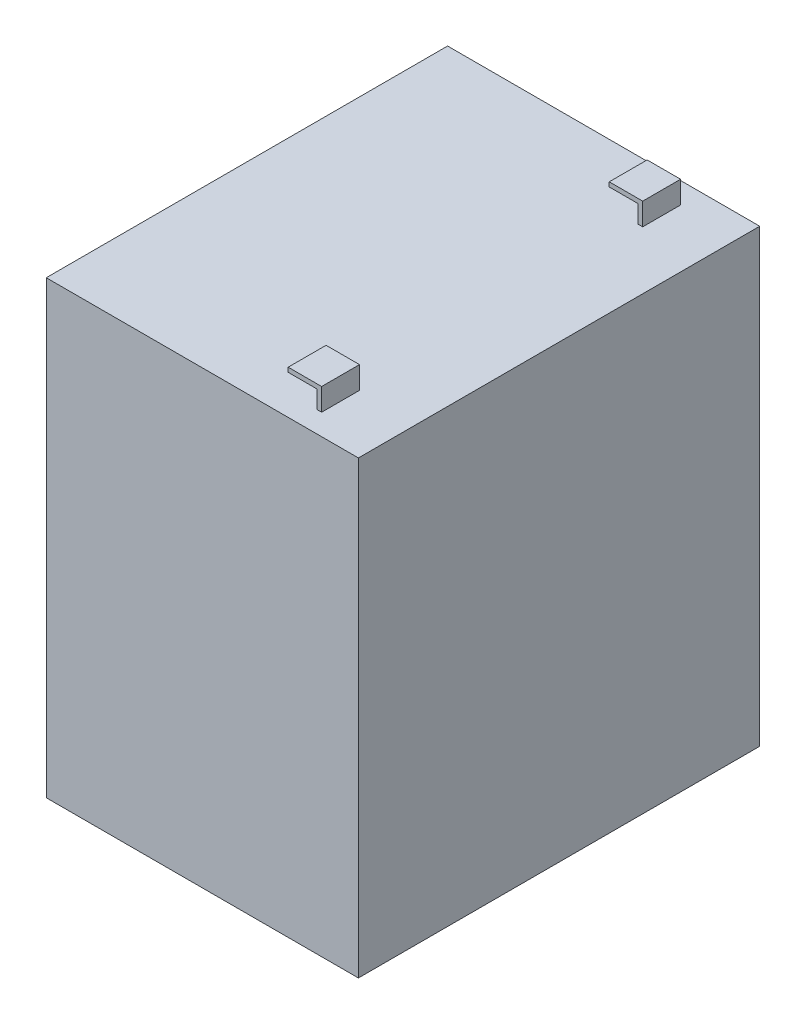
ISO-10303-21;
HEADER;
FILE_DESCRIPTION(('STEP AP214'),'2;1');
FILE_NAME('part.step','',(''),(''),'','','');
FILE_SCHEMA(('AUTOMOTIVE_DESIGN { 1 0 10303 214 1 1 1 1 }'));
ENDSEC;
DATA;
#1=APPLICATION_CONTEXT('core data for automotive mechanical design processes');
#2=APPLICATION_PROTOCOL_DEFINITION('international standard','automotive_design',2000,#1);
#3=PRODUCT_CONTEXT('',#1,'mechanical');
#4=PRODUCT('Part','Part','',(#3));
#5=PRODUCT_RELATED_PRODUCT_CATEGORY('part','',(#4));
#6=PRODUCT_DEFINITION_FORMATION('','',#4);
#7=PRODUCT_DEFINITION_CONTEXT('part definition',#1,'design');
#8=PRODUCT_DEFINITION('design','',#6,#7);
#9=PRODUCT_DEFINITION_SHAPE('','',#8);
#10=(LENGTH_UNIT() NAMED_UNIT(*) SI_UNIT(.MILLI.,.METRE.));
#11=(NAMED_UNIT(*) PLANE_ANGLE_UNIT() SI_UNIT($,.RADIAN.));
#12=(NAMED_UNIT(*) SI_UNIT($,.STERADIAN.) SOLID_ANGLE_UNIT());
#13=UNCERTAINTY_MEASURE_WITH_UNIT(LENGTH_MEASURE(1.E-05),#10,'distance_accuracy_value','');
#14=(GEOMETRIC_REPRESENTATION_CONTEXT(3) GLOBAL_UNCERTAINTY_ASSIGNED_CONTEXT((#13)) GLOBAL_UNIT_ASSIGNED_CONTEXT((#10,
#11,#12)) REPRESENTATION_CONTEXT('',''));
#15=CARTESIAN_POINT('',(0.,0.,0.));
#16=DIRECTION('',(0.,0.,1.));
#17=DIRECTION('',(1.,0.,0.));
#18=AXIS2_PLACEMENT_3D('',#15,#16,#17);
#19=CARTESIAN_POINT('',(-35.,101.,45.));
#20=DIRECTION('',(0.,1.,0.));
#21=DIRECTION('',(0.,0.,1.));
#22=AXIS2_PLACEMENT_3D('',#19,#20,#21);
#23=PLANE('',#22);
#24=DIRECTION('',(1.,0.,0.));
#25=VECTOR('',#24,1.);
#26=CARTESIAN_POINT('',(14.5,101.,-31.75));
#27=LINE('',#26,#25);
#28=CARTESIAN_POINT('',(21.,101.,-31.75));
#29=VERTEX_POINT('',#28);
#30=CARTESIAN_POINT('',(22.,101.,-31.75));
#31=VERTEX_POINT('',#30);
#32=EDGE_CURVE('E193',#29,#31,#27,.T.);
#33=ORIENTED_EDGE('',*,*,#32,.F.);
#34=DIRECTION('',(0.,0.,1.));
#35=VECTOR('',#34,1.);
#36=CARTESIAN_POINT('',(21.,101.,-45.));
#37=LINE('',#36,#35);
#38=CARTESIAN_POINT('',(21.,101.,-40.25));
#39=VERTEX_POINT('',#38);
#40=EDGE_CURVE('E48',#39,#29,#37,.T.);
#41=ORIENTED_EDGE('',*,*,#40,.F.);
#42=DIRECTION('',(-1.,0.,0.));
#43=VECTOR('',#42,1.);
#44=CARTESIAN_POINT('',(14.5,101.,-40.25));
#45=LINE('',#44,#43);
#46=CARTESIAN_POINT('',(22.,101.,-40.25));
#47=VERTEX_POINT('',#46);
#48=EDGE_CURVE('E198',#47,#39,#45,.T.);
#49=ORIENTED_EDGE('',*,*,#48,.F.);
#50=DIRECTION('',(0.,0.,-1.));
#51=VECTOR('',#50,1.);
#52=CARTESIAN_POINT('',(22.,101.,-40.25));
#53=LINE('',#52,#51);
#54=EDGE_CURVE('E206',#31,#47,#53,.T.);
#55=ORIENTED_EDGE('',*,*,#54,.F.);
#56=EDGE_LOOP('',(#33,#41,#49,#55));
#57=FACE_BOUND('',#56,.T.);
#58=DIRECTION('',(-1.,0.,0.));
#59=VECTOR('',#58,1.);
#60=CARTESIAN_POINT('',(-35.,101.,-45.));
#61=LINE('',#60,#59);
#62=CARTESIAN_POINT('',(35.,101.,-45.));
#63=VERTEX_POINT('',#62);
#64=CARTESIAN_POINT('',(-35.,101.,-45.));
#65=VERTEX_POINT('',#64);
#66=EDGE_CURVE('E234',#63,#65,#61,.T.);
#67=ORIENTED_EDGE('',*,*,#66,.T.);
#68=DIRECTION('',(0.,0.,1.));
#69=VECTOR('',#68,1.);
#70=CARTESIAN_POINT('',(-35.,101.,-45.));
#71=LINE('',#70,#69);
#72=CARTESIAN_POINT('',(-35.,101.,45.));
#73=VERTEX_POINT('',#72);
#74=EDGE_CURVE('E227',#65,#73,#71,.T.);
#75=ORIENTED_EDGE('',*,*,#74,.T.);
#76=DIRECTION('',(1.,0.,0.));
#77=VECTOR('',#76,1.);
#78=CARTESIAN_POINT('',(-35.,101.,45.));
#79=LINE('',#78,#77);
#80=CARTESIAN_POINT('',(35.,101.,45.));
#81=VERTEX_POINT('',#80);
#82=EDGE_CURVE('E230',#73,#81,#79,.T.);
#83=ORIENTED_EDGE('',*,*,#82,.T.);
#84=DIRECTION('',(0.,0.,-1.));
#85=VECTOR('',#84,1.);
#86=CARTESIAN_POINT('',(35.,101.,-45.));
#87=LINE('',#86,#85);
#88=EDGE_CURVE('E232',#81,#63,#87,.T.);
#89=ORIENTED_EDGE('',*,*,#88,.T.);
#90=EDGE_LOOP('',(#67,#75,#83,#89));
#91=FACE_BOUND('',#90,.T.);
#92=DIRECTION('',(1.,0.,0.));
#93=VECTOR('',#92,1.);
#94=CARTESIAN_POINT('',(14.5,101.,40.25));
#95=LINE('',#94,#93);
#96=CARTESIAN_POINT('',(21.,101.,40.25));
#97=VERTEX_POINT('',#96);
#98=CARTESIAN_POINT('',(22.,101.,40.25));
#99=VERTEX_POINT('',#98);
#100=EDGE_CURVE('E165',#97,#99,#95,.T.);
#101=ORIENTED_EDGE('',*,*,#100,.F.);
#102=CARTESIAN_POINT('',(21.,101.,31.75));
#103=VERTEX_POINT('',#102);
#104=EDGE_CURVE('E149',#103,#97,#37,.T.);
#105=ORIENTED_EDGE('',*,*,#104,.F.);
#106=DIRECTION('',(-1.,0.,0.));
#107=VECTOR('',#106,1.);
#108=CARTESIAN_POINT('',(14.5,101.,31.75));
#109=LINE('',#108,#107);
#110=CARTESIAN_POINT('',(22.,101.,31.75));
#111=VERTEX_POINT('',#110);
#112=EDGE_CURVE('E172',#111,#103,#109,.T.);
#113=ORIENTED_EDGE('',*,*,#112,.F.);
#114=DIRECTION('',(0.,0.,-1.));
#115=VECTOR('',#114,1.);
#116=CARTESIAN_POINT('',(22.,101.,40.25));
#117=LINE('',#116,#115);
#118=EDGE_CURVE('E169',#99,#111,#117,.T.);
#119=ORIENTED_EDGE('',*,*,#118,.F.);
#120=EDGE_LOOP('',(#101,#105,#113,#119));
#121=FACE_BOUND('',#120,.T.);
#122=ADVANCED_FACE('F33',(#57,#91,#121),#23,.T.);
#123=CARTESIAN_POINT('',(-35.,101.,-45.));
#124=DIRECTION('',(1.,0.,0.));
#125=DIRECTION('',(0.,0.,-1.));
#126=AXIS2_PLACEMENT_3D('',#123,#124,#125);
#127=PLANE('',#126);
#128=DIRECTION('',(0.,0.,1.));
#129=VECTOR('',#128,1.);
#130=CARTESIAN_POINT('',(-35.,0.,-45.));
#131=LINE('',#130,#129);
#132=CARTESIAN_POINT('',(-35.,0.,-45.));
#133=VERTEX_POINT('',#132);
#134=CARTESIAN_POINT('',(-35.,0.,45.));
#135=VERTEX_POINT('',#134);
#136=EDGE_CURVE('E218',#133,#135,#131,.T.);
#137=ORIENTED_EDGE('',*,*,#136,.T.);
#138=DIRECTION('',(0.,-1.,0.));
#139=VECTOR('',#138,1.);
#140=CARTESIAN_POINT('',(-35.,101.,45.));
#141=LINE('',#140,#139);
#142=EDGE_CURVE('E245',#73,#135,#141,.T.);
#143=ORIENTED_EDGE('',*,*,#142,.F.);
#144=ORIENTED_EDGE('',*,*,#74,.F.);
#145=DIRECTION('',(0.,-1.,0.));
#146=VECTOR('',#145,1.);
#147=CARTESIAN_POINT('',(-35.,101.,-45.));
#148=LINE('',#147,#146);
#149=EDGE_CURVE('E236',#65,#133,#148,.T.);
#150=ORIENTED_EDGE('',*,*,#149,.T.);
#151=EDGE_LOOP('',(#137,#143,#144,#150));
#152=FACE_BOUND('',#151,.T.);
#153=ADVANCED_FACE('F35',(#152),#127,.F.);
#154=CARTESIAN_POINT('',(-35.,101.,45.));
#155=DIRECTION('',(0.,0.,-1.));
#156=DIRECTION('',(-1.,0.,0.));
#157=AXIS2_PLACEMENT_3D('',#154,#155,#156);
#158=PLANE('',#157);
#159=DIRECTION('',(1.,0.,0.));
#160=VECTOR('',#159,1.);
#161=CARTESIAN_POINT('',(-35.,0.,45.));
#162=LINE('',#161,#160);
#163=CARTESIAN_POINT('',(35.,0.,45.));
#164=VERTEX_POINT('',#163);
#165=EDGE_CURVE('E221',#135,#164,#162,.T.);
#166=ORIENTED_EDGE('',*,*,#165,.T.);
#167=DIRECTION('',(0.,-1.,0.));
#168=VECTOR('',#167,1.);
#169=CARTESIAN_POINT('',(35.,101.,45.));
#170=LINE('',#169,#168);
#171=EDGE_CURVE('E242',#81,#164,#170,.T.);
#172=ORIENTED_EDGE('',*,*,#171,.F.);
#173=ORIENTED_EDGE('',*,*,#82,.F.);
#174=ORIENTED_EDGE('',*,*,#142,.T.);
#175=EDGE_LOOP('',(#166,#172,#173,#174));
#176=FACE_BOUND('',#175,.T.);
#177=ADVANCED_FACE('F282',(#176),#158,.F.);
#178=CARTESIAN_POINT('',(35.,101.,-45.));
#179=DIRECTION('',(-1.,0.,0.));
#180=DIRECTION('',(0.,0.,1.));
#181=AXIS2_PLACEMENT_3D('',#178,#179,#180);
#182=PLANE('',#181);
#183=DIRECTION('',(0.,0.,-1.));
#184=VECTOR('',#183,1.);
#185=CARTESIAN_POINT('',(35.,0.,-45.));
#186=LINE('',#185,#184);
#187=CARTESIAN_POINT('',(35.,0.,-45.));
#188=VERTEX_POINT('',#187);
#189=EDGE_CURVE('E223',#164,#188,#186,.T.);
#190=ORIENTED_EDGE('',*,*,#189,.T.);
#191=DIRECTION('',(0.,-1.,0.));
#192=VECTOR('',#191,1.);
#193=CARTESIAN_POINT('',(35.,101.,-45.));
#194=LINE('',#193,#192);
#195=EDGE_CURVE('E239',#63,#188,#194,.T.);
#196=ORIENTED_EDGE('',*,*,#195,.F.);
#197=ORIENTED_EDGE('',*,*,#88,.F.);
#198=ORIENTED_EDGE('',*,*,#171,.T.);
#199=EDGE_LOOP('',(#190,#196,#197,#198));
#200=FACE_BOUND('',#199,.T.);
#201=ADVANCED_FACE('F292',(#200),#182,.F.);
#202=CARTESIAN_POINT('',(-35.,101.,-45.));
#203=DIRECTION('',(0.,0.,1.));
#204=DIRECTION('',(1.,0.,0.));
#205=AXIS2_PLACEMENT_3D('',#202,#203,#204);
#206=PLANE('',#205);
#207=DIRECTION('',(-1.,0.,0.));
#208=VECTOR('',#207,1.);
#209=CARTESIAN_POINT('',(-35.,0.,-45.));
#210=LINE('',#209,#208);
#211=EDGE_CURVE('E225',#188,#133,#210,.T.);
#212=ORIENTED_EDGE('',*,*,#211,.T.);
#213=ORIENTED_EDGE('',*,*,#149,.F.);
#214=ORIENTED_EDGE('',*,*,#66,.F.);
#215=ORIENTED_EDGE('',*,*,#195,.T.);
#216=EDGE_LOOP('',(#212,#213,#214,#215));
#217=FACE_BOUND('',#216,.T.);
#218=ADVANCED_FACE('F289',(#217),#206,.F.);
#219=CARTESIAN_POINT('',(-35.,0.,45.));
#220=DIRECTION('',(0.,1.,0.));
#221=DIRECTION('',(0.,0.,1.));
#222=AXIS2_PLACEMENT_3D('',#219,#220,#221);
#223=PLANE('',#222);
#224=ORIENTED_EDGE('',*,*,#136,.F.);
#225=ORIENTED_EDGE('',*,*,#211,.F.);
#226=ORIENTED_EDGE('',*,*,#189,.F.);
#227=ORIENTED_EDGE('',*,*,#165,.F.);
#228=EDGE_LOOP('',(#224,#225,#226,#227));
#229=FACE_BOUND('',#228,.T.);
#230=ADVANCED_FACE('F287',(#229),#223,.F.);
#231=CARTESIAN_POINT('',(14.5,106.,-40.25));
#232=DIRECTION('',(1.,0.,0.));
#233=DIRECTION('',(0.,0.,-1.));
#234=AXIS2_PLACEMENT_3D('',#231,#232,#233);
#235=PLANE('',#234);
#236=DIRECTION('',(0.,-1.,0.));
#237=VECTOR('',#236,1.);
#238=CARTESIAN_POINT('',(14.5,106.,-40.25));
#239=LINE('',#238,#237);
#240=CARTESIAN_POINT('',(14.5,106.,-40.25));
#241=VERTEX_POINT('',#240);
#242=CARTESIAN_POINT('',(14.5,105.,-40.25));
#243=VERTEX_POINT('',#242);
#244=EDGE_CURVE('E204',#241,#243,#239,.T.);
#245=ORIENTED_EDGE('',*,*,#244,.T.);
#246=DIRECTION('',(0.,0.,1.));
#247=VECTOR('',#246,1.);
#248=CARTESIAN_POINT('',(14.5,105.,-45.));
#249=LINE('',#248,#247);
#250=CARTESIAN_POINT('',(14.5,105.,-31.75));
#251=VERTEX_POINT('',#250);
#252=EDGE_CURVE('E348',#243,#251,#249,.T.);
#253=ORIENTED_EDGE('',*,*,#252,.T.);
#254=DIRECTION('',(0.,-1.,0.));
#255=VECTOR('',#254,1.);
#256=CARTESIAN_POINT('',(14.5,106.,-31.75));
#257=LINE('',#256,#255);
#258=CARTESIAN_POINT('',(14.5,106.,-31.75));
#259=VERTEX_POINT('',#258);
#260=EDGE_CURVE('E215',#259,#251,#257,.T.);
#261=ORIENTED_EDGE('',*,*,#260,.F.);
#262=DIRECTION('',(0.,0.,1.));
#263=VECTOR('',#262,1.);
#264=CARTESIAN_POINT('',(14.5,106.,-40.25));
#265=LINE('',#264,#263);
#266=EDGE_CURVE('E194',#241,#259,#265,.T.);
#267=ORIENTED_EDGE('',*,*,#266,.F.);
#268=EDGE_LOOP('',(#245,#253,#261,#267));
#269=FACE_BOUND('',#268,.T.);
#270=ADVANCED_FACE('F312',(#269),#235,.F.);
#271=CARTESIAN_POINT('',(14.5,106.,-31.75));
#272=DIRECTION('',(0.,0.,-1.));
#273=DIRECTION('',(-1.,0.,0.));
#274=AXIS2_PLACEMENT_3D('',#271,#272,#273);
#275=PLANE('',#274);
#276=ORIENTED_EDGE('',*,*,#260,.T.);
#277=DIRECTION('',(1.,0.,0.));
#278=VECTOR('',#277,1.);
#279=CARTESIAN_POINT('',(14.5,105.,-31.75));
#280=LINE('',#279,#278);
#281=CARTESIAN_POINT('',(21.,105.,-31.75));
#282=VERTEX_POINT('',#281);
#283=EDGE_CURVE('E351',#251,#282,#280,.T.);
#284=ORIENTED_EDGE('',*,*,#283,.T.);
#285=DIRECTION('',(0.,-1.,0.));
#286=VECTOR('',#285,1.);
#287=CARTESIAN_POINT('',(21.,106.,-31.75));
#288=LINE('',#287,#286);
#289=EDGE_CURVE('E170',#282,#29,#288,.T.);
#290=ORIENTED_EDGE('',*,*,#289,.T.);
#291=ORIENTED_EDGE('',*,*,#32,.T.);
#292=DIRECTION('',(0.,-1.,0.));
#293=VECTOR('',#292,1.);
#294=CARTESIAN_POINT('',(22.,106.,-31.75));
#295=LINE('',#294,#293);
#296=CARTESIAN_POINT('',(22.,106.,-31.75));
#297=VERTEX_POINT('',#296);
#298=EDGE_CURVE('E212',#297,#31,#295,.T.);
#299=ORIENTED_EDGE('',*,*,#298,.F.);
#300=DIRECTION('',(1.,0.,0.));
#301=VECTOR('',#300,1.);
#302=CARTESIAN_POINT('',(14.5,106.,-31.75));
#303=LINE('',#302,#301);
#304=EDGE_CURVE('E197',#259,#297,#303,.T.);
#305=ORIENTED_EDGE('',*,*,#304,.F.);
#306=EDGE_LOOP('',(#276,#284,#290,#291,#299,#305));
#307=FACE_BOUND('',#306,.T.);
#308=ADVANCED_FACE('F316',(#307),#275,.F.);
#309=CARTESIAN_POINT('',(22.,106.,-40.25));
#310=DIRECTION('',(-1.,0.,0.));
#311=DIRECTION('',(0.,0.,1.));
#312=AXIS2_PLACEMENT_3D('',#309,#310,#311);
#313=PLANE('',#312);
#314=ORIENTED_EDGE('',*,*,#54,.T.);
#315=DIRECTION('',(0.,-1.,0.));
#316=VECTOR('',#315,1.);
#317=CARTESIAN_POINT('',(22.,106.,-40.25));
#318=LINE('',#317,#316);
#319=CARTESIAN_POINT('',(22.,106.,-40.25));
#320=VERTEX_POINT('',#319);
#321=EDGE_CURVE('E56',#320,#47,#318,.T.);
#322=ORIENTED_EDGE('',*,*,#321,.F.);
#323=DIRECTION('',(0.,0.,-1.));
#324=VECTOR('',#323,1.);
#325=CARTESIAN_POINT('',(22.,106.,-40.25));
#326=LINE('',#325,#324);
#327=EDGE_CURVE('E200',#297,#320,#326,.T.);
#328=ORIENTED_EDGE('',*,*,#327,.F.);
#329=ORIENTED_EDGE('',*,*,#298,.T.);
#330=EDGE_LOOP('',(#314,#322,#328,#329));
#331=FACE_BOUND('',#330,.T.);
#332=ADVANCED_FACE('F321',(#331),#313,.F.);
#333=CARTESIAN_POINT('',(14.5,106.,-40.25));
#334=DIRECTION('',(0.,0.,1.));
#335=DIRECTION('',(1.,0.,0.));
#336=AXIS2_PLACEMENT_3D('',#333,#334,#335);
#337=PLANE('',#336);
#338=DIRECTION('',(0.,1.,0.));
#339=VECTOR('',#338,1.);
#340=CARTESIAN_POINT('',(21.,106.,-40.25));
#341=LINE('',#340,#339);
#342=CARTESIAN_POINT('',(21.,105.,-40.25));
#343=VERTEX_POINT('',#342);
#344=EDGE_CURVE('E175',#39,#343,#341,.T.);
#345=ORIENTED_EDGE('',*,*,#344,.T.);
#346=DIRECTION('',(-1.,0.,0.));
#347=VECTOR('',#346,1.);
#348=CARTESIAN_POINT('',(14.5,105.,-40.25));
#349=LINE('',#348,#347);
#350=EDGE_CURVE('E347',#343,#243,#349,.T.);
#351=ORIENTED_EDGE('',*,*,#350,.T.);
#352=ORIENTED_EDGE('',*,*,#244,.F.);
#353=DIRECTION('',(-1.,0.,0.));
#354=VECTOR('',#353,1.);
#355=CARTESIAN_POINT('',(14.5,106.,-40.25));
#356=LINE('',#355,#354);
#357=EDGE_CURVE('E202',#320,#241,#356,.T.);
#358=ORIENTED_EDGE('',*,*,#357,.F.);
#359=ORIENTED_EDGE('',*,*,#321,.T.);
#360=ORIENTED_EDGE('',*,*,#48,.T.);
#361=EDGE_LOOP('',(#345,#351,#352,#358,#359,#360));
#362=FACE_BOUND('',#361,.T.);
#363=ADVANCED_FACE('F327',(#362),#337,.F.);
#364=CARTESIAN_POINT('',(0.,106.,0.));
#365=DIRECTION('',(0.,1.,0.));
#366=DIRECTION('',(0.,0.,1.));
#367=AXIS2_PLACEMENT_3D('',#364,#365,#366);
#368=PLANE('',#367);
#369=ORIENTED_EDGE('',*,*,#266,.T.);
#370=ORIENTED_EDGE('',*,*,#304,.T.);
#371=ORIENTED_EDGE('',*,*,#327,.T.);
#372=ORIENTED_EDGE('',*,*,#357,.T.);
#373=EDGE_LOOP('',(#369,#370,#371,#372));
#374=FACE_BOUND('',#373,.T.);
#375=ADVANCED_FACE('F331',(#374),#368,.T.);
#376=CARTESIAN_POINT('',(14.5,106.,40.25));
#377=DIRECTION('',(0.,0.,-1.));
#378=DIRECTION('',(-1.,0.,0.));
#379=AXIS2_PLACEMENT_3D('',#376,#377,#378);
#380=PLANE('',#379);
#381=DIRECTION('',(0.,-1.,0.));
#382=VECTOR('',#381,1.);
#383=CARTESIAN_POINT('',(14.5,106.,40.25));
#384=LINE('',#383,#382);
#385=CARTESIAN_POINT('',(14.5,106.,40.25));
#386=VERTEX_POINT('',#385);
#387=CARTESIAN_POINT('',(14.5,105.,40.25));
#388=VERTEX_POINT('',#387);
#389=EDGE_CURVE('E183',#386,#388,#384,.T.);
#390=ORIENTED_EDGE('',*,*,#389,.T.);
#391=DIRECTION('',(-1.,0.,0.));
#392=VECTOR('',#391,1.);
#393=CARTESIAN_POINT('',(14.5,105.,40.25));
#394=LINE('',#393,#392);
#395=CARTESIAN_POINT('',(21.,105.,40.25));
#396=VERTEX_POINT('',#395);
#397=EDGE_CURVE('E159',#396,#388,#394,.T.);
#398=ORIENTED_EDGE('',*,*,#397,.F.);
#399=DIRECTION('',(0.,1.,0.));
#400=VECTOR('',#399,1.);
#401=CARTESIAN_POINT('',(21.,101.,40.25));
#402=LINE('',#401,#400);
#403=EDGE_CURVE('E153',#97,#396,#402,.T.);
#404=ORIENTED_EDGE('',*,*,#403,.F.);
#405=ORIENTED_EDGE('',*,*,#100,.T.);
#406=DIRECTION('',(0.,-1.,0.));
#407=VECTOR('',#406,1.);
#408=CARTESIAN_POINT('',(22.,106.,40.25));
#409=LINE('',#408,#407);
#410=CARTESIAN_POINT('',(22.,106.,40.25));
#411=VERTEX_POINT('',#410);
#412=EDGE_CURVE('E191',#411,#99,#409,.T.);
#413=ORIENTED_EDGE('',*,*,#412,.F.);
#414=DIRECTION('',(1.,0.,0.));
#415=VECTOR('',#414,1.);
#416=CARTESIAN_POINT('',(14.5,106.,40.25));
#417=LINE('',#416,#415);
#418=EDGE_CURVE('E182',#386,#411,#417,.T.);
#419=ORIENTED_EDGE('',*,*,#418,.F.);
#420=EDGE_LOOP('',(#390,#398,#404,#405,#413,#419));
#421=FACE_BOUND('',#420,.T.);
#422=ADVANCED_FACE('F163',(#421),#380,.F.);
#423=CARTESIAN_POINT('',(22.,106.,40.25));
#424=DIRECTION('',(-1.,0.,0.));
#425=DIRECTION('',(0.,0.,1.));
#426=AXIS2_PLACEMENT_3D('',#423,#424,#425);
#427=PLANE('',#426);
#428=ORIENTED_EDGE('',*,*,#118,.T.);
#429=DIRECTION('',(0.,-1.,0.));
#430=VECTOR('',#429,1.);
#431=CARTESIAN_POINT('',(22.,106.,31.75));
#432=LINE('',#431,#430);
#433=CARTESIAN_POINT('',(22.,106.,31.75));
#434=VERTEX_POINT('',#433);
#435=EDGE_CURVE('E188',#434,#111,#432,.T.);
#436=ORIENTED_EDGE('',*,*,#435,.F.);
#437=DIRECTION('',(0.,0.,-1.));
#438=VECTOR('',#437,1.);
#439=CARTESIAN_POINT('',(22.,106.,40.25));
#440=LINE('',#439,#438);
#441=EDGE_CURVE('E258',#411,#434,#440,.T.);
#442=ORIENTED_EDGE('',*,*,#441,.F.);
#443=ORIENTED_EDGE('',*,*,#412,.T.);
#444=EDGE_LOOP('',(#428,#436,#442,#443));
#445=FACE_BOUND('',#444,.T.);
#446=ADVANCED_FACE('F337',(#445),#427,.F.);
#447=CARTESIAN_POINT('',(14.5,106.,31.75));
#448=DIRECTION('',(0.,0.,1.));
#449=DIRECTION('',(1.,0.,0.));
#450=AXIS2_PLACEMENT_3D('',#447,#448,#449);
#451=PLANE('',#450);
#452=DIRECTION('',(0.,1.,0.));
#453=VECTOR('',#452,1.);
#454=CARTESIAN_POINT('',(21.,106.,31.75));
#455=LINE('',#454,#453);
#456=CARTESIAN_POINT('',(21.,105.,31.75));
#457=VERTEX_POINT('',#456);
#458=EDGE_CURVE('E11',#103,#457,#455,.T.);
#459=ORIENTED_EDGE('',*,*,#458,.T.);
#460=DIRECTION('',(-1.,0.,0.));
#461=VECTOR('',#460,1.);
#462=CARTESIAN_POINT('',(14.5,105.,31.75));
#463=LINE('',#462,#461);
#464=CARTESIAN_POINT('',(14.5,105.,31.75));
#465=VERTEX_POINT('',#464);
#466=EDGE_CURVE('E345',#457,#465,#463,.T.);
#467=ORIENTED_EDGE('',*,*,#466,.T.);
#468=DIRECTION('',(0.,-1.,0.));
#469=VECTOR('',#468,1.);
#470=CARTESIAN_POINT('',(14.5,106.,31.75));
#471=LINE('',#470,#469);
#472=CARTESIAN_POINT('',(14.5,106.,31.75));
#473=VERTEX_POINT('',#472);
#474=EDGE_CURVE('E185',#473,#465,#471,.T.);
#475=ORIENTED_EDGE('',*,*,#474,.F.);
#476=DIRECTION('',(-1.,0.,0.));
#477=VECTOR('',#476,1.);
#478=CARTESIAN_POINT('',(14.5,106.,31.75));
#479=LINE('',#478,#477);
#480=EDGE_CURVE('E260',#434,#473,#479,.T.);
#481=ORIENTED_EDGE('',*,*,#480,.F.);
#482=ORIENTED_EDGE('',*,*,#435,.T.);
#483=ORIENTED_EDGE('',*,*,#112,.T.);
#484=EDGE_LOOP('',(#459,#467,#475,#481,#482,#483));
#485=FACE_BOUND('',#484,.T.);
#486=ADVANCED_FACE('F274',(#485),#451,.F.);
#487=CARTESIAN_POINT('',(14.5,106.,40.25));
#488=DIRECTION('',(1.,0.,0.));
#489=DIRECTION('',(0.,0.,-1.));
#490=AXIS2_PLACEMENT_3D('',#487,#488,#489);
#491=PLANE('',#490);
#492=ORIENTED_EDGE('',*,*,#474,.T.);
#493=DIRECTION('',(0.,0.,1.));
#494=VECTOR('',#493,1.);
#495=CARTESIAN_POINT('',(14.5,105.,40.25));
#496=LINE('',#495,#494);
#497=EDGE_CURVE('E41',#465,#388,#496,.T.);
#498=ORIENTED_EDGE('',*,*,#497,.T.);
#499=ORIENTED_EDGE('',*,*,#389,.F.);
#500=DIRECTION('',(0.,0.,1.));
#501=VECTOR('',#500,1.);
#502=CARTESIAN_POINT('',(14.5,106.,40.25));
#503=LINE('',#502,#501);
#504=EDGE_CURVE('E178',#473,#386,#503,.T.);
#505=ORIENTED_EDGE('',*,*,#504,.F.);
#506=EDGE_LOOP('',(#492,#498,#499,#505));
#507=FACE_BOUND('',#506,.T.);
#508=ADVANCED_FACE('F250',(#507),#491,.F.);
#509=CARTESIAN_POINT('',(0.,106.,0.));
#510=DIRECTION('',(0.,1.,0.));
#511=DIRECTION('',(0.,0.,1.));
#512=AXIS2_PLACEMENT_3D('',#509,#510,#511);
#513=PLANE('',#512);
#514=ORIENTED_EDGE('',*,*,#418,.T.);
#515=ORIENTED_EDGE('',*,*,#441,.T.);
#516=ORIENTED_EDGE('',*,*,#480,.T.);
#517=ORIENTED_EDGE('',*,*,#504,.T.);
#518=EDGE_LOOP('',(#514,#515,#516,#517));
#519=FACE_BOUND('',#518,.T.);
#520=ADVANCED_FACE('F264',(#519),#513,.T.);
#521=CARTESIAN_POINT('',(14.5,105.,-45.));
#522=DIRECTION('',(0.,1.,0.));
#523=DIRECTION('',(0.,0.,1.));
#524=AXIS2_PLACEMENT_3D('',#521,#522,#523);
#525=PLANE('',#524);
#526=DIRECTION('',(0.,0.,1.));
#527=VECTOR('',#526,1.);
#528=CARTESIAN_POINT('',(21.,105.,-45.));
#529=LINE('',#528,#527);
#530=EDGE_CURVE('E366',#457,#396,#529,.T.);
#531=ORIENTED_EDGE('',*,*,#530,.T.);
#532=ORIENTED_EDGE('',*,*,#397,.T.);
#533=ORIENTED_EDGE('',*,*,#497,.F.);
#534=ORIENTED_EDGE('',*,*,#466,.F.);
#535=EDGE_LOOP('',(#531,#532,#533,#534));
#536=FACE_BOUND('',#535,.T.);
#537=ADVANCED_FACE('F266',(#536),#525,.F.);
#538=CARTESIAN_POINT('',(21.,101.,-45.));
#539=DIRECTION('',(1.,0.,0.));
#540=DIRECTION('',(0.,0.,-1.));
#541=AXIS2_PLACEMENT_3D('',#538,#539,#540);
#542=PLANE('',#541);
#543=ORIENTED_EDGE('',*,*,#104,.T.);
#544=ORIENTED_EDGE('',*,*,#403,.T.);
#545=ORIENTED_EDGE('',*,*,#530,.F.);
#546=ORIENTED_EDGE('',*,*,#458,.F.);
#547=EDGE_LOOP('',(#543,#544,#545,#546));
#548=FACE_BOUND('',#547,.T.);
#549=ADVANCED_FACE('F151',(#548),#542,.F.);
#550=EDGE_CURVE('E354',#343,#282,#529,.T.);
#551=ORIENTED_EDGE('',*,*,#550,.F.);
#552=ORIENTED_EDGE('',*,*,#344,.F.);
#553=ORIENTED_EDGE('',*,*,#40,.T.);
#554=ORIENTED_EDGE('',*,*,#289,.F.);
#555=EDGE_LOOP('',(#551,#552,#553,#554));
#556=FACE_BOUND('',#555,.T.);
#557=ADVANCED_FACE('F363',(#556),#542,.F.);
#558=ORIENTED_EDGE('',*,*,#252,.F.);
#559=ORIENTED_EDGE('',*,*,#350,.F.);
#560=ORIENTED_EDGE('',*,*,#550,.T.);
#561=ORIENTED_EDGE('',*,*,#283,.F.);
#562=EDGE_LOOP('',(#558,#559,#560,#561));
#563=FACE_BOUND('',#562,.T.);
#564=ADVANCED_FACE('F273',(#563),#525,.F.);
#565=CLOSED_SHELL('',(#122,#153,#177,#201,#218,#230,#270,#308,#332,#363,#375,#422,#446,#486,
#508,#520,#537,#549,#557,#564));
#566=MANIFOLD_SOLID_BREP('B2',#565);
#567=ADVANCED_BREP_SHAPE_REPRESENTATION('',(#18,#566),#14);
#568=SHAPE_DEFINITION_REPRESENTATION(#9,#567);
ENDSEC;
END-ISO-10303-21;
